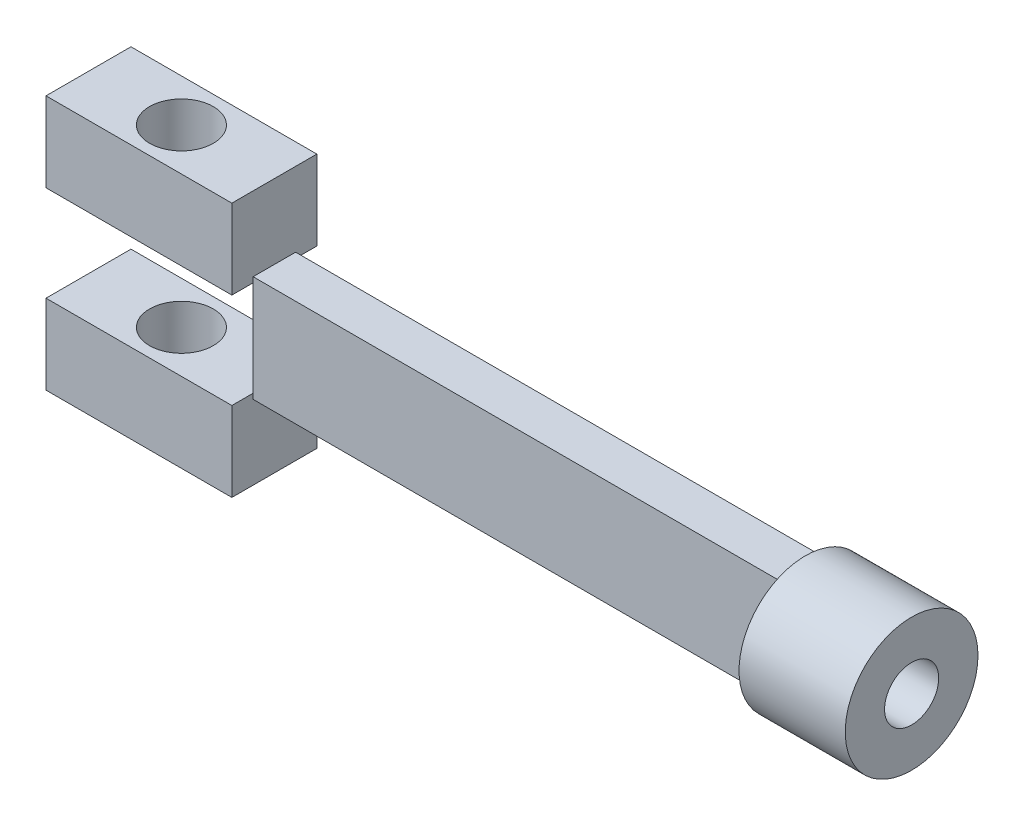
ISO-10303-21;
HEADER;
FILE_DESCRIPTION(('STEP AP214'),'2;1');
FILE_NAME('part.step','',(''),(''),'','','');
FILE_SCHEMA(('AUTOMOTIVE_DESIGN { 1 0 10303 214 1 1 1 1 }'));
ENDSEC;
DATA;
#1=APPLICATION_CONTEXT('core data for automotive mechanical design processes');
#2=APPLICATION_PROTOCOL_DEFINITION('international standard','automotive_design',2000,#1);
#3=PRODUCT_CONTEXT('',#1,'mechanical');
#4=PRODUCT('Part','Part','',(#3));
#5=PRODUCT_RELATED_PRODUCT_CATEGORY('part','',(#4));
#6=PRODUCT_DEFINITION_FORMATION('','',#4);
#7=PRODUCT_DEFINITION_CONTEXT('part definition',#1,'design');
#8=PRODUCT_DEFINITION('design','',#6,#7);
#9=PRODUCT_DEFINITION_SHAPE('','',#8);
#10=(LENGTH_UNIT() NAMED_UNIT(*) SI_UNIT(.MILLI.,.METRE.));
#11=(NAMED_UNIT(*) PLANE_ANGLE_UNIT() SI_UNIT($,.RADIAN.));
#12=(NAMED_UNIT(*) SI_UNIT($,.STERADIAN.) SOLID_ANGLE_UNIT());
#13=UNCERTAINTY_MEASURE_WITH_UNIT(LENGTH_MEASURE(1.E-05),#10,'distance_accuracy_value','');
#14=(GEOMETRIC_REPRESENTATION_CONTEXT(3) GLOBAL_UNCERTAINTY_ASSIGNED_CONTEXT((#13)) GLOBAL_UNIT_ASSIGNED_CONTEXT((#10,
#11,#12)) REPRESENTATION_CONTEXT('',''));
#15=CARTESIAN_POINT('',(0.,0.,0.));
#16=DIRECTION('',(0.,0.,1.));
#17=DIRECTION('',(1.,0.,0.));
#18=AXIS2_PLACEMENT_3D('',#15,#16,#17);
#19=CARTESIAN_POINT('',(-49.9999999999999,24.,8.));
#20=DIRECTION('',(0.,-1.,0.));
#21=DIRECTION('',(1.,0.,0.));
#22=AXIS2_PLACEMENT_3D('',#19,#20,#21);
#23=PLANE('',#22);
#24=DIRECTION('',(0.,0.,-1.));
#25=VECTOR('',#24,1.);
#26=CARTESIAN_POINT('',(-49.9999999999999,24.,8.));
#27=LINE('',#26,#25);
#28=CARTESIAN_POINT('',(-49.9999999999999,24.,8.));
#29=VERTEX_POINT('',#28);
#30=CARTESIAN_POINT('',(-49.9999999999999,24.,-8.));
#31=VERTEX_POINT('',#30);
#32=EDGE_CURVE('E387',#29,#31,#27,.T.);
#33=ORIENTED_EDGE('',*,*,#32,.T.);
#34=DIRECTION('',(-1.,0.,0.));
#35=VECTOR('',#34,1.);
#36=CARTESIAN_POINT('',(-49.9999999999999,24.,-8.));
#37=LINE('',#36,#35);
#38=CARTESIAN_POINT('',(-85.,24.,-8.));
#39=VERTEX_POINT('',#38);
#40=EDGE_CURVE('E342',#31,#39,#37,.T.);
#41=ORIENTED_EDGE('',*,*,#40,.T.);
#42=DIRECTION('',(0.,0.,-1.));
#43=VECTOR('',#42,1.);
#44=CARTESIAN_POINT('',(-85.,24.,8.));
#45=LINE('',#44,#43);
#46=CARTESIAN_POINT('',(-85.,24.,8.));
#47=VERTEX_POINT('',#46);
#48=EDGE_CURVE('E382',#47,#39,#45,.T.);
#49=ORIENTED_EDGE('',*,*,#48,.F.);
#50=DIRECTION('',(-1.,0.,0.));
#51=VECTOR('',#50,1.);
#52=CARTESIAN_POINT('',(-49.9999999999999,24.,8.));
#53=LINE('',#52,#51);
#54=EDGE_CURVE('E364',#29,#47,#53,.T.);
#55=ORIENTED_EDGE('',*,*,#54,.F.);
#56=EDGE_LOOP('',(#33,#41,#49,#55));
#57=FACE_BOUND('',#56,.T.);
#58=CARTESIAN_POINT('',(-67.4999999999999,24.000012,0.));
#59=DIRECTION('',(0.,1.,0.));
#60=DIRECTION('',(-1.,0.,0.));
#61=AXIS2_PLACEMENT_3D('',#58,#59,#60);
#62=CIRCLE('',#61,6.00000000000001);
#63=CARTESIAN_POINT('',(-73.5,24.000012,0.));
#64=VERTEX_POINT('',#63);
#65=EDGE_CURVE('E195',#64,#64,#62,.T.);
#66=ORIENTED_EDGE('',*,*,#65,.F.);
#67=EDGE_LOOP('',(#66));
#68=FACE_BOUND('',#67,.T.);
#69=ADVANCED_FACE('F47',(#57,#68),#23,.F.);
#70=CARTESIAN_POINT('',(-85.,24.,8.));
#71=DIRECTION('',(1.,0.,0.));
#72=DIRECTION('',(0.,1.,0.));
#73=AXIS2_PLACEMENT_3D('',#70,#71,#72);
#74=PLANE('',#73);
#75=DIRECTION('',(0.,0.,1.));
#76=VECTOR('',#75,1.);
#77=CARTESIAN_POINT('',(-85.,-9.,-8.));
#78=LINE('',#77,#76);
#79=CARTESIAN_POINT('',(-85.,-9.,-8.));
#80=VERTEX_POINT('',#79);
#81=CARTESIAN_POINT('',(-85.,-9.,8.));
#82=VERTEX_POINT('',#81);
#83=EDGE_CURVE('E328',#80,#82,#78,.T.);
#84=ORIENTED_EDGE('',*,*,#83,.F.);
#85=DIRECTION('',(0.,-1.,0.));
#86=VECTOR('',#85,1.);
#87=CARTESIAN_POINT('',(-85.,24.,-8.));
#88=LINE('',#87,#86);
#89=CARTESIAN_POINT('',(-84.9999999999999,-24.,-8.));
#90=VERTEX_POINT('',#89);
#91=EDGE_CURVE('E346',#80,#90,#88,.T.);
#92=ORIENTED_EDGE('',*,*,#91,.T.);
#93=DIRECTION('',(0.,0.,-1.));
#94=VECTOR('',#93,1.);
#95=CARTESIAN_POINT('',(-84.9999999999999,-24.,8.));
#96=LINE('',#95,#94);
#97=CARTESIAN_POINT('',(-84.9999999999999,-24.,8.));
#98=VERTEX_POINT('',#97);
#99=EDGE_CURVE('E377',#98,#90,#96,.T.);
#100=ORIENTED_EDGE('',*,*,#99,.F.);
#101=DIRECTION('',(0.,-1.,0.));
#102=VECTOR('',#101,1.);
#103=CARTESIAN_POINT('',(-85.,24.,8.));
#104=LINE('',#103,#102);
#105=EDGE_CURVE('E370',#82,#98,#104,.T.);
#106=ORIENTED_EDGE('',*,*,#105,.F.);
#107=EDGE_LOOP('',(#84,#92,#100,#106));
#108=FACE_BOUND('',#107,.T.);
#109=ADVANCED_FACE('F248',(#108),#74,.F.);
#110=CARTESIAN_POINT('',(0.,0.,8.));
#111=DIRECTION('',(0.,0.,-1.));
#112=DIRECTION('',(-1.,0.,0.));
#113=AXIS2_PLACEMENT_3D('',#110,#111,#112);
#114=PLANE('',#113);
#115=DIRECTION('',(-1.,0.,0.));
#116=VECTOR('',#115,1.);
#117=CARTESIAN_POINT('',(-49.9999999999999,9.,8.));
#118=LINE('',#117,#116);
#119=CARTESIAN_POINT('',(-49.9999999999999,9.,8.));
#120=VERTEX_POINT('',#119);
#121=CARTESIAN_POINT('',(-85.,9.,8.));
#122=VERTEX_POINT('',#121);
#123=EDGE_CURVE('E315',#120,#122,#118,.T.);
#124=ORIENTED_EDGE('',*,*,#123,.F.);
#125=DIRECTION('',(0.,1.,0.));
#126=VECTOR('',#125,1.);
#127=CARTESIAN_POINT('',(-49.9999999999999,24.,8.));
#128=LINE('',#127,#126);
#129=EDGE_CURVE('E356',#120,#29,#128,.T.);
#130=ORIENTED_EDGE('',*,*,#129,.T.);
#131=ORIENTED_EDGE('',*,*,#54,.T.);
#132=EDGE_CURVE('E367',#47,#122,#104,.T.);
#133=ORIENTED_EDGE('',*,*,#132,.T.);
#134=EDGE_LOOP('',(#124,#130,#131,#133));
#135=FACE_BOUND('',#134,.T.);
#136=ADVANCED_FACE('F241',(#135),#114,.F.);
#137=DIRECTION('',(1.,0.,0.));
#138=VECTOR('',#137,1.);
#139=CARTESIAN_POINT('',(-49.9999999999999,-9.,8.));
#140=LINE('',#139,#138);
#141=CARTESIAN_POINT('',(-49.9999999999999,-9.,8.));
#142=VERTEX_POINT('',#141);
#143=EDGE_CURVE('E314',#82,#142,#140,.T.);
#144=ORIENTED_EDGE('',*,*,#143,.F.);
#145=ORIENTED_EDGE('',*,*,#105,.T.);
#146=DIRECTION('',(1.,0.,0.));
#147=VECTOR('',#146,1.);
#148=CARTESIAN_POINT('',(-49.9999999999999,-24.,8.));
#149=LINE('',#148,#147);
#150=CARTESIAN_POINT('',(-49.9999999999999,-24.,8.));
#151=VERTEX_POINT('',#150);
#152=EDGE_CURVE('E372',#98,#151,#149,.T.);
#153=ORIENTED_EDGE('',*,*,#152,.T.);
#154=EDGE_CURVE('E363',#151,#142,#128,.T.);
#155=ORIENTED_EDGE('',*,*,#154,.T.);
#156=EDGE_LOOP('',(#144,#145,#153,#155));
#157=FACE_BOUND('',#156,.T.);
#158=ADVANCED_FACE('F243',(#157),#114,.F.);
#159=CARTESIAN_POINT('',(0.,0.,-8.));
#160=DIRECTION('',(0.,0.,-1.));
#161=DIRECTION('',(-1.,0.,0.));
#162=AXIS2_PLACEMENT_3D('',#159,#160,#161);
#163=PLANE('',#162);
#164=ORIENTED_EDGE('',*,*,#91,.F.);
#165=DIRECTION('',(1.,0.,0.));
#166=VECTOR('',#165,1.);
#167=CARTESIAN_POINT('',(-49.9999999999999,-9.,-8.));
#168=LINE('',#167,#166);
#169=CARTESIAN_POINT('',(-49.9999999999999,-9.,-8.));
#170=VERTEX_POINT('',#169);
#171=EDGE_CURVE('E317',#80,#170,#168,.T.);
#172=ORIENTED_EDGE('',*,*,#171,.T.);
#173=DIRECTION('',(0.,1.,0.));
#174=VECTOR('',#173,1.);
#175=CARTESIAN_POINT('',(-49.9999999999999,24.,-8.));
#176=LINE('',#175,#174);
#177=CARTESIAN_POINT('',(-49.9999999999999,-24.,-8.));
#178=VERTEX_POINT('',#177);
#179=EDGE_CURVE('E343',#178,#170,#176,.T.);
#180=ORIENTED_EDGE('',*,*,#179,.F.);
#181=DIRECTION('',(1.,0.,0.));
#182=VECTOR('',#181,1.);
#183=CARTESIAN_POINT('',(-49.9999999999999,-24.,-8.));
#184=LINE('',#183,#182);
#185=EDGE_CURVE('E352',#90,#178,#184,.T.);
#186=ORIENTED_EDGE('',*,*,#185,.F.);
#187=EDGE_LOOP('',(#164,#172,#180,#186));
#188=FACE_BOUND('',#187,.T.);
#189=ADVANCED_FACE('F240',(#188),#163,.T.);
#190=CARTESIAN_POINT('',(-49.9999999999999,9.,-8.));
#191=VERTEX_POINT('',#190);
#192=EDGE_CURVE('E339',#191,#31,#176,.T.);
#193=ORIENTED_EDGE('',*,*,#192,.F.);
#194=DIRECTION('',(-1.,0.,0.));
#195=VECTOR('',#194,1.);
#196=CARTESIAN_POINT('',(-49.9999999999999,9.,-8.));
#197=LINE('',#196,#195);
#198=CARTESIAN_POINT('',(-85.,9.,-8.));
#199=VERTEX_POINT('',#198);
#200=EDGE_CURVE('E316',#191,#199,#197,.T.);
#201=ORIENTED_EDGE('',*,*,#200,.T.);
#202=EDGE_CURVE('E353',#39,#199,#88,.T.);
#203=ORIENTED_EDGE('',*,*,#202,.F.);
#204=ORIENTED_EDGE('',*,*,#40,.F.);
#205=EDGE_LOOP('',(#193,#201,#203,#204));
#206=FACE_BOUND('',#205,.T.);
#207=ADVANCED_FACE('F238',(#206),#163,.T.);
#208=CARTESIAN_POINT('',(-49.9999999999999,24.,8.));
#209=DIRECTION('',(-1.,0.,0.));
#210=DIRECTION('',(0.,-1.,0.));
#211=AXIS2_PLACEMENT_3D('',#208,#209,#210);
#212=PLANE('',#211);
#213=DIRECTION('',(0.,0.,1.));
#214=VECTOR('',#213,1.);
#215=CARTESIAN_POINT('',(-49.9999999999999,9.,-8.));
#216=LINE('',#215,#214);
#217=CARTESIAN_POINT('',(-49.9999999999999,9.,-4.));
#218=VERTEX_POINT('',#217);
#219=EDGE_CURVE('E61',#191,#218,#216,.T.);
#220=ORIENTED_EDGE('',*,*,#219,.F.);
#221=ORIENTED_EDGE('',*,*,#192,.T.);
#222=ORIENTED_EDGE('',*,*,#32,.F.);
#223=ORIENTED_EDGE('',*,*,#129,.F.);
#224=CARTESIAN_POINT('',(-49.9999999999999,9.,4.));
#225=VERTEX_POINT('',#224);
#226=EDGE_CURVE('E11',#225,#120,#216,.T.);
#227=ORIENTED_EDGE('',*,*,#226,.F.);
#228=DIRECTION('',(0.,-1.,0.));
#229=VECTOR('',#228,1.);
#230=CARTESIAN_POINT('',(-49.9999999999999,-10.,4.));
#231=LINE('',#230,#229);
#232=CARTESIAN_POINT('',(-49.9999999999999,10.,4.));
#233=VERTEX_POINT('',#232);
#234=EDGE_CURVE('E293',#233,#225,#231,.T.);
#235=ORIENTED_EDGE('',*,*,#234,.F.);
#236=DIRECTION('',(0.,0.,-1.));
#237=VECTOR('',#236,1.);
#238=CARTESIAN_POINT('',(-49.9999999999999,10.,4.));
#239=LINE('',#238,#237);
#240=CARTESIAN_POINT('',(-49.9999999999999,10.,-4.));
#241=VERTEX_POINT('',#240);
#242=EDGE_CURVE('E291',#233,#241,#239,.T.);
#243=ORIENTED_EDGE('',*,*,#242,.T.);
#244=DIRECTION('',(0.,-1.,0.));
#245=VECTOR('',#244,1.);
#246=CARTESIAN_POINT('',(-49.9999999999999,-10.,-4.));
#247=LINE('',#246,#245);
#248=EDGE_CURVE('E281',#241,#218,#247,.T.);
#249=ORIENTED_EDGE('',*,*,#248,.T.);
#250=EDGE_LOOP('',(#220,#221,#222,#223,#227,#235,#243,#249));
#251=FACE_BOUND('',#250,.T.);
#252=ADVANCED_FACE('F265',(#251),#212,.F.);
#253=CARTESIAN_POINT('',(-49.9999999999999,10.,4.));
#254=DIRECTION('',(0.,-1.,0.));
#255=DIRECTION('',(0.,0.,-1.));
#256=AXIS2_PLACEMENT_3D('',#253,#254,#255);
#257=PLANE('',#256);
#258=DIRECTION('',(-1.,0.,0.));
#259=VECTOR('',#258,1.);
#260=CARTESIAN_POINT('',(-49.9999999999999,10.,-4.));
#261=LINE('',#260,#259);
#262=CARTESIAN_POINT('',(50.0000000000001,10.,-4.));
#263=VERTEX_POINT('',#262);
#264=EDGE_CURVE('E395',#263,#241,#261,.T.);
#265=ORIENTED_EDGE('',*,*,#264,.T.);
#266=ORIENTED_EDGE('',*,*,#242,.F.);
#267=DIRECTION('',(-1.,0.,0.));
#268=VECTOR('',#267,1.);
#269=CARTESIAN_POINT('',(-49.9999999999999,10.,4.));
#270=LINE('',#269,#268);
#271=CARTESIAN_POINT('',(50.0000000000001,10.,4.));
#272=VERTEX_POINT('',#271);
#273=EDGE_CURVE('E102',#272,#233,#270,.T.);
#274=ORIENTED_EDGE('',*,*,#273,.F.);
#275=DIRECTION('',(0.,0.,-1.));
#276=VECTOR('',#275,1.);
#277=CARTESIAN_POINT('',(50.0000000000001,10.,4.));
#278=LINE('',#277,#276);
#279=EDGE_CURVE('E305',#272,#263,#278,.T.);
#280=ORIENTED_EDGE('',*,*,#279,.T.);
#281=EDGE_LOOP('',(#265,#266,#274,#280));
#282=FACE_BOUND('',#281,.T.);
#283=ADVANCED_FACE('F51',(#282),#257,.F.);
#284=CARTESIAN_POINT('',(-49.9999999999999,-10.,4.));
#285=DIRECTION('',(0.,1.,0.));
#286=DIRECTION('',(0.,0.,1.));
#287=AXIS2_PLACEMENT_3D('',#284,#285,#286);
#288=PLANE('',#287);
#289=DIRECTION('',(1.,0.,0.));
#290=VECTOR('',#289,1.);
#291=CARTESIAN_POINT('',(-49.9999999999999,-10.,-4.));
#292=LINE('',#291,#290);
#293=CARTESIAN_POINT('',(-49.9999999999999,-10.,-4.));
#294=VERTEX_POINT('',#293);
#295=CARTESIAN_POINT('',(50.0000000000001,-10.,-4.));
#296=VERTEX_POINT('',#295);
#297=EDGE_CURVE('E277',#294,#296,#292,.T.);
#298=ORIENTED_EDGE('',*,*,#297,.T.);
#299=DIRECTION('',(0.,0.,-1.));
#300=VECTOR('',#299,1.);
#301=CARTESIAN_POINT('',(50.0000000000001,-10.,4.));
#302=LINE('',#301,#300);
#303=CARTESIAN_POINT('',(50.0000000000001,-10.,4.));
#304=VERTEX_POINT('',#303);
#305=EDGE_CURVE('E279',#304,#296,#302,.T.);
#306=ORIENTED_EDGE('',*,*,#305,.F.);
#307=DIRECTION('',(1.,0.,0.));
#308=VECTOR('',#307,1.);
#309=CARTESIAN_POINT('',(-49.9999999999999,-10.,4.));
#310=LINE('',#309,#308);
#311=CARTESIAN_POINT('',(-49.9999999999999,-10.,4.));
#312=VERTEX_POINT('',#311);
#313=EDGE_CURVE('E77',#312,#304,#310,.T.);
#314=ORIENTED_EDGE('',*,*,#313,.F.);
#315=DIRECTION('',(0.,0.,-1.));
#316=VECTOR('',#315,1.);
#317=CARTESIAN_POINT('',(-49.9999999999999,-10.,4.));
#318=LINE('',#317,#316);
#319=EDGE_CURVE('E278',#312,#294,#318,.T.);
#320=ORIENTED_EDGE('',*,*,#319,.T.);
#321=EDGE_LOOP('',(#298,#306,#314,#320));
#322=FACE_BOUND('',#321,.T.);
#323=ADVANCED_FACE('F266',(#322),#288,.F.);
#324=CARTESIAN_POINT('',(0.,0.,4.));
#325=DIRECTION('',(0.,0.,-1.));
#326=DIRECTION('',(-1.,0.,0.));
#327=AXIS2_PLACEMENT_3D('',#324,#325,#326);
#328=PLANE('',#327);
#329=DIRECTION('',(0.,1.,0.));
#330=VECTOR('',#329,1.);
#331=CARTESIAN_POINT('',(50.0000000000001,-10.,4.));
#332=LINE('',#331,#330);
#333=EDGE_CURVE('E285',#304,#272,#332,.T.);
#334=ORIENTED_EDGE('',*,*,#333,.T.);
#335=ORIENTED_EDGE('',*,*,#273,.T.);
#336=ORIENTED_EDGE('',*,*,#234,.T.);
#337=CARTESIAN_POINT('',(-49.9999999999999,-9.,4.));
#338=VERTEX_POINT('',#337);
#339=EDGE_CURVE('E406',#225,#338,#231,.T.);
#340=ORIENTED_EDGE('',*,*,#339,.T.);
#341=EDGE_CURVE('E403',#338,#312,#231,.T.);
#342=ORIENTED_EDGE('',*,*,#341,.T.);
#343=ORIENTED_EDGE('',*,*,#313,.T.);
#344=EDGE_LOOP('',(#334,#335,#336,#340,#342,#343));
#345=FACE_BOUND('',#344,.T.);
#346=ADVANCED_FACE('F263',(#345),#328,.F.);
#347=CARTESIAN_POINT('',(0.,0.,-4.));
#348=DIRECTION('',(0.,0.,-1.));
#349=DIRECTION('',(-1.,0.,0.));
#350=AXIS2_PLACEMENT_3D('',#347,#348,#349);
#351=PLANE('',#350);
#352=DIRECTION('',(0.,1.,0.));
#353=VECTOR('',#352,1.);
#354=CARTESIAN_POINT('',(50.0000000000001,-10.,-4.));
#355=LINE('',#354,#353);
#356=EDGE_CURVE('E286',#296,#263,#355,.T.);
#357=ORIENTED_EDGE('',*,*,#356,.F.);
#358=ORIENTED_EDGE('',*,*,#297,.F.);
#359=CARTESIAN_POINT('',(-49.9999999999999,-9.,-4.));
#360=VERTEX_POINT('',#359);
#361=EDGE_CURVE('E96',#360,#294,#247,.T.);
#362=ORIENTED_EDGE('',*,*,#361,.F.);
#363=EDGE_CURVE('E396',#218,#360,#247,.T.);
#364=ORIENTED_EDGE('',*,*,#363,.F.);
#365=ORIENTED_EDGE('',*,*,#248,.F.);
#366=ORIENTED_EDGE('',*,*,#264,.F.);
#367=EDGE_LOOP('',(#357,#358,#362,#364,#365,#366));
#368=FACE_BOUND('',#367,.T.);
#369=ADVANCED_FACE('F261',(#368),#351,.T.);
#370=ORIENTED_EDGE('',*,*,#179,.T.);
#371=DIRECTION('',(0.,0.,1.));
#372=VECTOR('',#371,1.);
#373=CARTESIAN_POINT('',(-49.9999999999999,-9.,-8.));
#374=LINE('',#373,#372);
#375=EDGE_CURVE('E338',#170,#360,#374,.T.);
#376=ORIENTED_EDGE('',*,*,#375,.T.);
#377=ORIENTED_EDGE('',*,*,#361,.T.);
#378=ORIENTED_EDGE('',*,*,#319,.F.);
#379=ORIENTED_EDGE('',*,*,#341,.F.);
#380=EDGE_CURVE('E63',#338,#142,#374,.T.);
#381=ORIENTED_EDGE('',*,*,#380,.T.);
#382=ORIENTED_EDGE('',*,*,#154,.F.);
#383=DIRECTION('',(0.,0.,-1.));
#384=VECTOR('',#383,1.);
#385=CARTESIAN_POINT('',(-49.9999999999999,-24.,8.));
#386=LINE('',#385,#384);
#387=EDGE_CURVE('E376',#151,#178,#386,.T.);
#388=ORIENTED_EDGE('',*,*,#387,.T.);
#389=EDGE_LOOP('',(#370,#376,#377,#378,#379,#381,#382,#388));
#390=FACE_BOUND('',#389,.T.);
#391=ADVANCED_FACE('F251',(#390),#212,.F.);
#392=ORIENTED_EDGE('',*,*,#202,.T.);
#393=DIRECTION('',(0.,0.,1.));
#394=VECTOR('',#393,1.);
#395=CARTESIAN_POINT('',(-85.,9.,-8.));
#396=LINE('',#395,#394);
#397=EDGE_CURVE('E72',#199,#122,#396,.T.);
#398=ORIENTED_EDGE('',*,*,#397,.T.);
#399=ORIENTED_EDGE('',*,*,#132,.F.);
#400=ORIENTED_EDGE('',*,*,#48,.T.);
#401=EDGE_LOOP('',(#392,#398,#399,#400));
#402=FACE_BOUND('',#401,.T.);
#403=ADVANCED_FACE('F247',(#402),#74,.F.);
#404=CARTESIAN_POINT('',(-49.9999999999999,-24.,8.));
#405=DIRECTION('',(0.,1.,0.));
#406=DIRECTION('',(-1.,0.,0.));
#407=AXIS2_PLACEMENT_3D('',#404,#405,#406);
#408=PLANE('',#407);
#409=CARTESIAN_POINT('',(-67.4999999999999,-24.,0.));
#410=DIRECTION('',(0.,1.,0.));
#411=DIRECTION('',(-1.,0.,0.));
#412=AXIS2_PLACEMENT_3D('',#409,#410,#411);
#413=CIRCLE('',#412,6.);
#414=CARTESIAN_POINT('',(-73.5,-24.,0.));
#415=VERTEX_POINT('',#414);
#416=EDGE_CURVE('E194',#415,#415,#413,.T.);
#417=ORIENTED_EDGE('',*,*,#416,.T.);
#418=EDGE_LOOP('',(#417));
#419=FACE_BOUND('',#418,.T.);
#420=ORIENTED_EDGE('',*,*,#99,.T.);
#421=ORIENTED_EDGE('',*,*,#185,.T.);
#422=ORIENTED_EDGE('',*,*,#387,.F.);
#423=ORIENTED_EDGE('',*,*,#152,.F.);
#424=EDGE_LOOP('',(#420,#421,#422,#423));
#425=FACE_BOUND('',#424,.T.);
#426=ADVANCED_FACE('F232',(#419,#425),#408,.F.);
#427=CARTESIAN_POINT('',(-49.9999999999999,9.,-8.));
#428=DIRECTION('',(1.,0.,0.));
#429=DIRECTION('',(0.,0.,-1.));
#430=AXIS2_PLACEMENT_3D('',#427,#428,#429);
#431=PLANE('',#430);
#432=ORIENTED_EDGE('',*,*,#363,.T.);
#433=EDGE_CURVE('E335',#360,#338,#374,.T.);
#434=ORIENTED_EDGE('',*,*,#433,.T.);
#435=ORIENTED_EDGE('',*,*,#339,.F.);
#436=EDGE_CURVE('E64',#218,#225,#216,.T.);
#437=ORIENTED_EDGE('',*,*,#436,.F.);
#438=EDGE_LOOP('',(#432,#434,#435,#437));
#439=FACE_BOUND('',#438,.T.);
#440=ADVANCED_FACE('F226',(#439),#431,.F.);
#441=CARTESIAN_POINT('',(-49.9999999999999,-9.,-8.));
#442=DIRECTION('',(0.,-1.,0.));
#443=DIRECTION('',(1.,0.,0.));
#444=AXIS2_PLACEMENT_3D('',#441,#442,#443);
#445=PLANE('',#444);
#446=CARTESIAN_POINT('',(-67.4999999999999,-9.,0.));
#447=DIRECTION('',(0.,-1.,0.));
#448=DIRECTION('',(1.,0.,0.));
#449=AXIS2_PLACEMENT_3D('',#446,#447,#448);
#450=CIRCLE('',#449,6.);
#451=CARTESIAN_POINT('',(-61.4999999999999,-9.,0.));
#452=VERTEX_POINT('',#451);
#453=EDGE_CURVE('E210',#452,#452,#450,.T.);
#454=ORIENTED_EDGE('',*,*,#453,.T.);
#455=EDGE_LOOP('',(#454));
#456=FACE_BOUND('',#455,.T.);
#457=ORIENTED_EDGE('',*,*,#375,.F.);
#458=ORIENTED_EDGE('',*,*,#171,.F.);
#459=ORIENTED_EDGE('',*,*,#83,.T.);
#460=ORIENTED_EDGE('',*,*,#143,.T.);
#461=ORIENTED_EDGE('',*,*,#380,.F.);
#462=ORIENTED_EDGE('',*,*,#433,.F.);
#463=EDGE_LOOP('',(#457,#458,#459,#460,#461,#462));
#464=FACE_BOUND('',#463,.T.);
#465=ADVANCED_FACE('F221',(#456,#464),#445,.F.);
#466=CARTESIAN_POINT('',(-49.9999999999999,9.,-8.));
#467=DIRECTION('',(0.,1.,0.));
#468=DIRECTION('',(-1.,0.,0.));
#469=AXIS2_PLACEMENT_3D('',#466,#467,#468);
#470=PLANE('',#469);
#471=CARTESIAN_POINT('',(-67.4999999999999,9.,0.));
#472=DIRECTION('',(0.,1.,0.));
#473=DIRECTION('',(-1.,0.,0.));
#474=AXIS2_PLACEMENT_3D('',#471,#472,#473);
#475=CIRCLE('',#474,6.);
#476=CARTESIAN_POINT('',(-73.5,9.,0.));
#477=VERTEX_POINT('',#476);
#478=EDGE_CURVE('E196',#477,#477,#475,.T.);
#479=ORIENTED_EDGE('',*,*,#478,.T.);
#480=EDGE_LOOP('',(#479));
#481=FACE_BOUND('',#480,.T.);
#482=ORIENTED_EDGE('',*,*,#397,.F.);
#483=ORIENTED_EDGE('',*,*,#200,.F.);
#484=ORIENTED_EDGE('',*,*,#219,.T.);
#485=ORIENTED_EDGE('',*,*,#436,.T.);
#486=ORIENTED_EDGE('',*,*,#226,.T.);
#487=ORIENTED_EDGE('',*,*,#123,.T.);
#488=EDGE_LOOP('',(#482,#483,#484,#485,#486,#487));
#489=FACE_BOUND('',#488,.T.);
#490=ADVANCED_FACE('F230',(#481,#489),#470,.F.);
#491=CARTESIAN_POINT('',(-67.4999999999999,-24.,0.));
#492=DIRECTION('',(0.,1.,0.));
#493=DIRECTION('',(-1.,0.,0.));
#494=AXIS2_PLACEMENT_3D('',#491,#492,#493);
#495=CYLINDRICAL_SURFACE('',#494,6.);
#496=ORIENTED_EDGE('',*,*,#65,.T.);
#497=EDGE_LOOP('',(#496));
#498=FACE_BOUND('',#497,.T.);
#499=ORIENTED_EDGE('',*,*,#478,.F.);
#500=EDGE_LOOP('',(#499));
#501=FACE_BOUND('',#500,.T.);
#502=ADVANCED_FACE('F219',(#498,#501),#495,.F.);
#503=ORIENTED_EDGE('',*,*,#416,.F.);
#504=EDGE_LOOP('',(#503));
#505=FACE_BOUND('',#504,.T.);
#506=ORIENTED_EDGE('',*,*,#453,.F.);
#507=EDGE_LOOP('',(#506));
#508=FACE_BOUND('',#507,.T.);
#509=ADVANCED_FACE('F207',(#505,#508),#495,.F.);
#510=CARTESIAN_POINT('',(50.0000000000001,0.,0.));
#511=DIRECTION('',(1.,0.,0.));
#512=DIRECTION('',(0.,0.,-1.));
#513=AXIS2_PLACEMENT_3D('',#510,#511,#512);
#514=PLANE('',#513);
#515=CARTESIAN_POINT('',(50.0000000000001,0.,0.));
#516=DIRECTION('',(1.,0.,0.));
#517=DIRECTION('',(0.,0.,-1.));
#518=AXIS2_PLACEMENT_3D('',#515,#516,#517);
#519=CIRCLE('',#518,12.5);
#520=CARTESIAN_POINT('',(50.0000000000001,0.,-12.5));
#521=VERTEX_POINT('',#520);
#522=EDGE_CURVE('E179',#521,#521,#519,.T.);
#523=ORIENTED_EDGE('',*,*,#522,.F.);
#524=EDGE_LOOP('',(#523));
#525=FACE_BOUND('',#524,.T.);
#526=ORIENTED_EDGE('',*,*,#305,.T.);
#527=ORIENTED_EDGE('',*,*,#356,.T.);
#528=ORIENTED_EDGE('',*,*,#279,.F.);
#529=ORIENTED_EDGE('',*,*,#333,.F.);
#530=EDGE_LOOP('',(#526,#527,#528,#529));
#531=FACE_BOUND('',#530,.T.);
#532=ADVANCED_FACE('F218',(#525,#531),#514,.F.);
#533=CARTESIAN_POINT('',(70.0000000000001,0.,0.));
#534=DIRECTION('',(-1.,0.,0.));
#535=DIRECTION('',(0.,0.,1.));
#536=AXIS2_PLACEMENT_3D('',#533,#534,#535);
#537=CYLINDRICAL_SURFACE('',#536,12.5);
#538=CARTESIAN_POINT('',(70.0000000000001,0.,0.));
#539=DIRECTION('',(1.,0.,0.));
#540=DIRECTION('',(0.,0.,-1.));
#541=AXIS2_PLACEMENT_3D('',#538,#539,#540);
#542=CIRCLE('',#541,12.5);
#543=CARTESIAN_POINT('',(70.0000000000001,0.,-12.5));
#544=VERTEX_POINT('',#543);
#545=EDGE_CURVE('E183',#544,#544,#542,.T.);
#546=ORIENTED_EDGE('',*,*,#545,.F.);
#547=EDGE_LOOP('',(#546));
#548=FACE_BOUND('',#547,.T.);
#549=ORIENTED_EDGE('',*,*,#522,.T.);
#550=EDGE_LOOP('',(#549));
#551=FACE_BOUND('',#550,.T.);
#552=ADVANCED_FACE('F225',(#548,#551),#537,.T.);
#553=CARTESIAN_POINT('',(70.0000000000001,0.,0.));
#554=DIRECTION('',(1.,0.,0.));
#555=DIRECTION('',(0.,0.,-1.));
#556=AXIS2_PLACEMENT_3D('',#553,#554,#555);
#557=PLANE('',#556);
#558=CARTESIAN_POINT('',(70.0000000000001,0.,0.));
#559=DIRECTION('',(1.,0.,0.));
#560=DIRECTION('',(0.,0.,-1.));
#561=AXIS2_PLACEMENT_3D('',#558,#559,#560);
#562=CIRCLE('',#561,5.1);
#563=CARTESIAN_POINT('',(70.0000000000001,0.,-5.1));
#564=VERTEX_POINT('',#563);
#565=EDGE_CURVE('E177',#564,#564,#562,.T.);
#566=ORIENTED_EDGE('',*,*,#565,.F.);
#567=EDGE_LOOP('',(#566));
#568=FACE_BOUND('',#567,.T.);
#569=ORIENTED_EDGE('',*,*,#545,.T.);
#570=EDGE_LOOP('',(#569));
#571=FACE_BOUND('',#570,.T.);
#572=ADVANCED_FACE('F175',(#568,#571),#557,.T.);
#573=CARTESIAN_POINT('',(52.0000000000001,0.,0.));
#574=DIRECTION('',(1.,0.,0.));
#575=DIRECTION('',(0.,0.,-1.));
#576=AXIS2_PLACEMENT_3D('',#573,#574,#575);
#577=CONICAL_SURFACE('',#576,5.09999999999999,1.02974425867665);
#578=CARTESIAN_POINT('',(48.9356108429595,0.,0.));
#579=VERTEX_POINT('',#578);
#580=VERTEX_LOOP('',#579);
#581=FACE_BOUND('',#580,.T.);
#582=CARTESIAN_POINT('',(52.0000000000001,0.,0.));
#583=DIRECTION('',(1.,0.,0.));
#584=DIRECTION('',(0.,0.,-1.));
#585=AXIS2_PLACEMENT_3D('',#582,#583,#584);
#586=CIRCLE('',#585,5.09999999999999);
#587=CARTESIAN_POINT('',(52.0000000000001,0.,-5.09999999999999));
#588=VERTEX_POINT('',#587);
#589=EDGE_CURVE('E178',#588,#588,#586,.T.);
#590=ORIENTED_EDGE('',*,*,#589,.T.);
#591=EDGE_LOOP('',(#590));
#592=FACE_BOUND('',#591,.T.);
#593=ADVANCED_FACE('F169',(#581,#592),#577,.F.);
#594=CARTESIAN_POINT('',(70.0000000000001,0.,0.));
#595=DIRECTION('',(1.,0.,0.));
#596=DIRECTION('',(0.,0.,-1.));
#597=AXIS2_PLACEMENT_3D('',#594,#595,#596);
#598=CYLINDRICAL_SURFACE('',#597,5.1);
#599=ORIENTED_EDGE('',*,*,#589,.F.);
#600=EDGE_LOOP('',(#599));
#601=FACE_BOUND('',#600,.T.);
#602=ORIENTED_EDGE('',*,*,#565,.T.);
#603=EDGE_LOOP('',(#602));
#604=FACE_BOUND('',#603,.T.);
#605=ADVANCED_FACE('F173',(#601,#604),#598,.F.);
#606=CLOSED_SHELL('',(#69,#109,#136,#158,#189,#207,#252,#283,#323,#346,#369,#391,#403,#426,#440,
#465,#490,#502,#509,#532,#552,#572,#593,#605));
#607=MANIFOLD_SOLID_BREP('B2',#606);
#608=ADVANCED_BREP_SHAPE_REPRESENTATION('',(#18,#607),#14);
#609=SHAPE_DEFINITION_REPRESENTATION(#9,#608);
ENDSEC;
END-ISO-10303-21;
